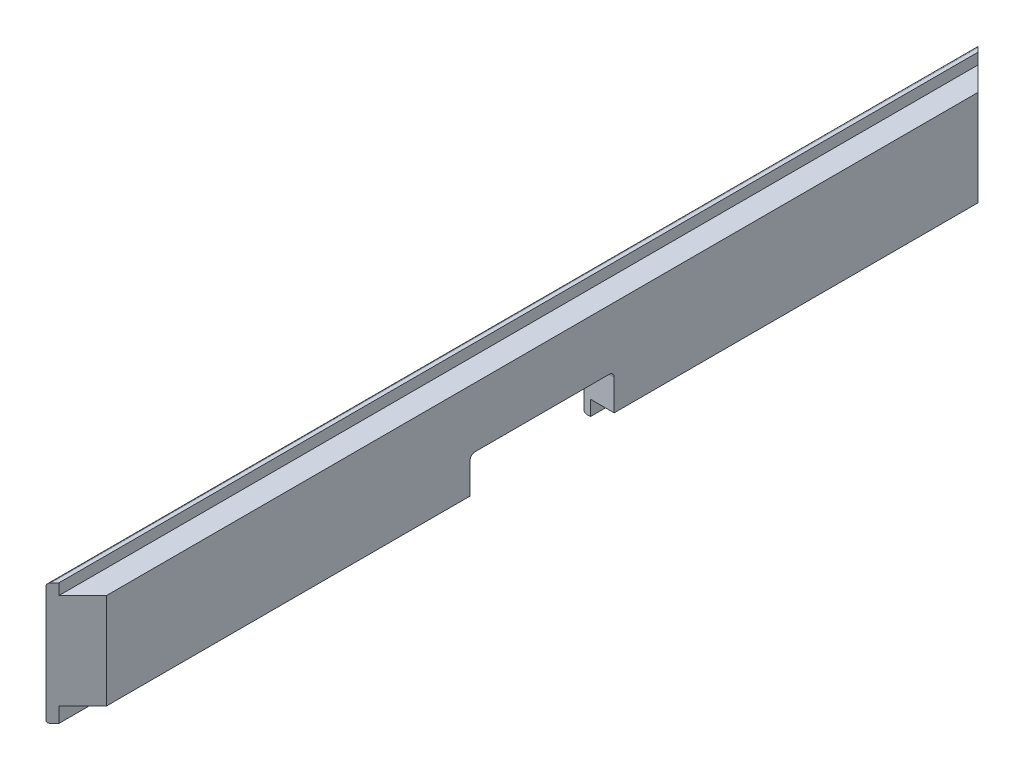
ISO-10303-21;
HEADER;
FILE_DESCRIPTION(('STEP AP214'),'2;1');
FILE_NAME('part.step','',(''),(''),'','','');
FILE_SCHEMA(('AUTOMOTIVE_DESIGN { 1 0 10303 214 1 1 1 1 }'));
ENDSEC;
DATA;
#1=APPLICATION_CONTEXT('core data for automotive mechanical design processes');
#2=APPLICATION_PROTOCOL_DEFINITION('international standard','automotive_design',2000,#1);
#3=PRODUCT_CONTEXT('',#1,'mechanical');
#4=PRODUCT('Part','Part','',(#3));
#5=PRODUCT_RELATED_PRODUCT_CATEGORY('part','',(#4));
#6=PRODUCT_DEFINITION_FORMATION('','',#4);
#7=PRODUCT_DEFINITION_CONTEXT('part definition',#1,'design');
#8=PRODUCT_DEFINITION('design','',#6,#7);
#9=PRODUCT_DEFINITION_SHAPE('','',#8);
#10=(LENGTH_UNIT() NAMED_UNIT(*) SI_UNIT(.MILLI.,.METRE.));
#11=(NAMED_UNIT(*) PLANE_ANGLE_UNIT() SI_UNIT($,.RADIAN.));
#12=(NAMED_UNIT(*) SI_UNIT($,.STERADIAN.) SOLID_ANGLE_UNIT());
#13=UNCERTAINTY_MEASURE_WITH_UNIT(LENGTH_MEASURE(1.E-05),#10,'distance_accuracy_value','');
#14=(GEOMETRIC_REPRESENTATION_CONTEXT(3) GLOBAL_UNCERTAINTY_ASSIGNED_CONTEXT((#13)) GLOBAL_UNIT_ASSIGNED_CONTEXT((#10,
#11,#12)) REPRESENTATION_CONTEXT('',''));
#15=CARTESIAN_POINT('',(0.,0.,0.));
#16=DIRECTION('',(0.,0.,1.));
#17=DIRECTION('',(1.,0.,0.));
#18=AXIS2_PLACEMENT_3D('',#15,#16,#17);
#19=CARTESIAN_POINT('',(0.,0.,294.55));
#20=DIRECTION('',(0.,1.,0.));
#21=DIRECTION('',(-1.,0.,0.));
#22=AXIS2_PLACEMENT_3D('',#19,#20,#21);
#23=PLANE('',#22);
#24=DIRECTION('',(-1.,0.,0.));
#25=VECTOR('',#24,1.);
#26=CARTESIAN_POINT('',(19.05,0.,45.525));
#27=LINE('',#26,#25);
#28=CARTESIAN_POINT('',(4.05,0.,45.525));
#29=VERTEX_POINT('',#28);
#30=CARTESIAN_POINT('',(1.5875,0.,45.525));
#31=VERTEX_POINT('',#30);
#32=EDGE_CURVE('E189',#29,#31,#27,.T.);
#33=ORIENTED_EDGE('',*,*,#32,.F.);
#34=DIRECTION('',(0.,0.,-1.));
#35=VECTOR('',#34,1.);
#36=CARTESIAN_POINT('',(4.05,0.,294.55));
#37=LINE('',#36,#35);
#38=CARTESIAN_POINT('',(4.05,0.,290.5));
#39=VERTEX_POINT('',#38);
#40=EDGE_CURVE('E206',#39,#29,#37,.T.);
#41=ORIENTED_EDGE('',*,*,#40,.F.);
#42=DIRECTION('',(0.707106781186547,0.,-0.707106781186548));
#43=VECTOR('',#42,1.);
#44=CARTESIAN_POINT('',(147.275,0.,147.275));
#45=LINE('',#44,#43);
#46=CARTESIAN_POINT('',(1.5875,0.,292.9625));
#47=VERTEX_POINT('',#46);
#48=EDGE_CURVE('E301',#47,#39,#45,.T.);
#49=ORIENTED_EDGE('',*,*,#48,.F.);
#50=DIRECTION('',(0.,0.,-1.));
#51=VECTOR('',#50,1.);
#52=CARTESIAN_POINT('',(1.5875,0.,-294.55));
#53=LINE('',#52,#51);
#54=EDGE_CURVE('E215',#47,#31,#53,.T.);
#55=ORIENTED_EDGE('',*,*,#54,.T.);
#56=EDGE_LOOP('',(#33,#41,#49,#55));
#57=FACE_BOUND('',#56,.T.);
#58=ADVANCED_FACE('F43',(#57),#23,.F.);
#59=CARTESIAN_POINT('',(4.05,0.,294.55));
#60=DIRECTION('',(-1.,0.,0.));
#61=DIRECTION('',(0.,0.,1.));
#62=AXIS2_PLACEMENT_3D('',#59,#60,#61);
#63=PLANE('',#62);
#64=DIRECTION('',(0.,-1.,0.));
#65=VECTOR('',#64,1.);
#66=CARTESIAN_POINT('',(4.05,0.,45.525));
#67=LINE('',#66,#65);
#68=CARTESIAN_POINT('',(4.05,9.525,45.525));
#69=VERTEX_POINT('',#68);
#70=EDGE_CURVE('E287',#69,#29,#67,.T.);
#71=ORIENTED_EDGE('',*,*,#70,.F.);
#72=DIRECTION('',(0.,0.,-1.));
#73=VECTOR('',#72,1.);
#74=CARTESIAN_POINT('',(4.05,9.525,294.55));
#75=LINE('',#74,#73);
#76=CARTESIAN_POINT('',(4.05,9.525,290.5));
#77=VERTEX_POINT('',#76);
#78=EDGE_CURVE('E207',#77,#69,#75,.T.);
#79=ORIENTED_EDGE('',*,*,#78,.F.);
#80=DIRECTION('',(0.,1.,0.));
#81=VECTOR('',#80,1.);
#82=CARTESIAN_POINT('',(4.05,0.,290.5));
#83=LINE('',#82,#81);
#84=EDGE_CURVE('E337',#39,#77,#83,.T.);
#85=ORIENTED_EDGE('',*,*,#84,.F.);
#86=ORIENTED_EDGE('',*,*,#40,.T.);
#87=EDGE_LOOP('',(#71,#79,#85,#86));
#88=FACE_BOUND('',#87,.T.);
#89=ADVANCED_FACE('F385',(#88),#63,.F.);
#90=CARTESIAN_POINT('',(0.,9.525,294.55));
#91=DIRECTION('',(0.,-1.,0.));
#92=DIRECTION('',(1.,0.,0.));
#93=AXIS2_PLACEMENT_3D('',#90,#91,#92);
#94=PLANE('',#93);
#95=CARTESIAN_POINT('',(11.55,9.525,104.55));
#96=DIRECTION('',(0.,-1.,0.));
#97=DIRECTION('',(0.,0.,-1.));
#98=AXIS2_PLACEMENT_3D('',#95,#96,#97);
#99=CIRCLE('',#98,3.95);
#100=CARTESIAN_POINT('',(11.55,9.525,100.6));
#101=VERTEX_POINT('',#100);
#102=EDGE_CURVE('E289',#101,#101,#99,.T.);
#103=ORIENTED_EDGE('',*,*,#102,.F.);
#104=EDGE_LOOP('',(#103));
#105=FACE_BOUND('',#104,.T.);
#106=ORIENTED_EDGE('',*,*,#78,.T.);
#107=DIRECTION('',(1.,0.,0.));
#108=VECTOR('',#107,1.);
#109=CARTESIAN_POINT('',(0.,9.525,45.525));
#110=LINE('',#109,#108);
#111=CARTESIAN_POINT('',(19.05,9.525,45.525));
#112=VERTEX_POINT('',#111);
#113=EDGE_CURVE('E285',#69,#112,#110,.T.);
#114=ORIENTED_EDGE('',*,*,#113,.T.);
#115=DIRECTION('',(0.,0.,-1.));
#116=VECTOR('',#115,1.);
#117=CARTESIAN_POINT('',(19.05,9.525,294.55));
#118=LINE('',#117,#116);
#119=CARTESIAN_POINT('',(19.05,9.525,275.5));
#120=VERTEX_POINT('',#119);
#121=EDGE_CURVE('E275',#120,#112,#118,.T.);
#122=ORIENTED_EDGE('',*,*,#121,.F.);
#123=DIRECTION('',(-0.707106781186547,0.,0.707106781186548));
#124=VECTOR('',#123,1.);
#125=CARTESIAN_POINT('',(0.,9.525,294.55));
#126=LINE('',#125,#124);
#127=EDGE_CURVE('E334',#120,#77,#126,.T.);
#128=ORIENTED_EDGE('',*,*,#127,.T.);
#129=EDGE_LOOP('',(#106,#114,#122,#128));
#130=FACE_BOUND('',#129,.T.);
#131=ADVANCED_FACE('F364',(#105,#130),#94,.T.);
#132=CARTESIAN_POINT('',(19.05,0.,294.55));
#133=DIRECTION('',(-1.,0.,0.));
#134=DIRECTION('',(0.,0.,1.));
#135=AXIS2_PLACEMENT_3D('',#132,#133,#134);
#136=PLANE('',#135);
#137=DIRECTION('',(0.,-1.,0.));
#138=VECTOR('',#137,1.);
#139=CARTESIAN_POINT('',(19.05,0.,45.525));
#140=LINE('',#139,#138);
#141=CARTESIAN_POINT('',(19.05,29.04,45.525));
#142=VERTEX_POINT('',#141);
#143=EDGE_CURVE('E272',#142,#112,#140,.T.);
#144=ORIENTED_EDGE('',*,*,#143,.F.);
#145=CARTESIAN_POINT('',(19.05,29.04,42.35));
#146=DIRECTION('',(-1.,0.,0.));
#147=DIRECTION('',(0.,0.,1.));
#148=AXIS2_PLACEMENT_3D('',#145,#146,#147);
#149=CIRCLE('',#148,3.175);
#150=CARTESIAN_POINT('',(19.05,32.215,42.35));
#151=VERTEX_POINT('',#150);
#152=EDGE_CURVE('E11',#142,#151,#149,.T.);
#153=ORIENTED_EDGE('',*,*,#152,.T.);
#154=DIRECTION('',(0.,0.,1.));
#155=VECTOR('',#154,1.);
#156=CARTESIAN_POINT('',(19.05,32.215,0.));
#157=LINE('',#156,#155);
#158=CARTESIAN_POINT('',(19.05,32.215,-42.35));
#159=VERTEX_POINT('',#158);
#160=EDGE_CURVE('E256',#159,#151,#157,.T.);
#161=ORIENTED_EDGE('',*,*,#160,.F.);
#162=CARTESIAN_POINT('',(19.05,29.04,-42.35));
#163=DIRECTION('',(-1.,0.,0.));
#164=DIRECTION('',(0.,0.,1.));
#165=AXIS2_PLACEMENT_3D('',#162,#163,#164);
#166=CIRCLE('',#165,3.175);
#167=CARTESIAN_POINT('',(19.05,29.04,-45.525));
#168=VERTEX_POINT('',#167);
#169=EDGE_CURVE('E250',#159,#168,#166,.T.);
#170=ORIENTED_EDGE('',*,*,#169,.T.);
#171=DIRECTION('',(0.,-1.,0.));
#172=VECTOR('',#171,1.);
#173=CARTESIAN_POINT('',(19.05,0.,-45.525));
#174=LINE('',#173,#172);
#175=CARTESIAN_POINT('',(19.05,9.525,-45.525));
#176=VERTEX_POINT('',#175);
#177=EDGE_CURVE('E190',#168,#176,#174,.T.);
#178=ORIENTED_EDGE('',*,*,#177,.T.);
#179=CARTESIAN_POINT('',(19.05,9.525,-275.5));
#180=VERTEX_POINT('',#179);
#181=EDGE_CURVE('E352',#176,#180,#118,.T.);
#182=ORIENTED_EDGE('',*,*,#181,.T.);
#183=DIRECTION('',(0.,1.,0.));
#184=VECTOR('',#183,1.);
#185=CARTESIAN_POINT('',(19.05,0.,-275.5));
#186=LINE('',#185,#184);
#187=CARTESIAN_POINT('',(19.05,70.,-275.5));
#188=VERTEX_POINT('',#187);
#189=EDGE_CURVE('E304',#180,#188,#186,.T.);
#190=ORIENTED_EDGE('',*,*,#189,.T.);
#191=DIRECTION('',(0.,0.,-1.));
#192=VECTOR('',#191,1.);
#193=CARTESIAN_POINT('',(19.05,70.,294.55));
#194=LINE('',#193,#192);
#195=CARTESIAN_POINT('',(19.05,70.,275.5));
#196=VERTEX_POINT('',#195);
#197=EDGE_CURVE('E350',#196,#188,#194,.T.);
#198=ORIENTED_EDGE('',*,*,#197,.F.);
#199=DIRECTION('',(0.,1.,0.));
#200=VECTOR('',#199,1.);
#201=CARTESIAN_POINT('',(19.05,0.,275.5));
#202=LINE('',#201,#200);
#203=EDGE_CURVE('E303',#120,#196,#202,.T.);
#204=ORIENTED_EDGE('',*,*,#203,.F.);
#205=ORIENTED_EDGE('',*,*,#121,.T.);
#206=EDGE_LOOP('',(#144,#153,#161,#170,#178,#182,#190,#198,#204,#205));
#207=FACE_BOUND('',#206,.T.);
#208=ADVANCED_FACE('F254',(#207),#136,.F.);
#209=CARTESIAN_POINT('',(1.5875,1.5875,294.55));
#210=DIRECTION('',(0.,0.,1.));
#211=DIRECTION('',(1.,0.,0.));
#212=AXIS2_PLACEMENT_3D('',#209,#210,#211);
#213=CYLINDRICAL_SURFACE('',#212,1.5875);
#214=DIRECTION('',(0.,0.,-1.));
#215=VECTOR('',#214,1.);
#216=CARTESIAN_POINT('',(0.,1.5875,294.55));
#217=LINE('',#216,#215);
#218=CARTESIAN_POINT('',(0.,1.5875,45.525));
#219=VERTEX_POINT('',#218);
#220=CARTESIAN_POINT('',(0.,1.5875,294.55));
#221=VERTEX_POINT('',#220);
#222=EDGE_CURVE('E221',#219,#221,#217,.F.);
#223=ORIENTED_EDGE('',*,*,#222,.F.);
#224=CARTESIAN_POINT('',(1.5875,1.5875,45.525));
#225=DIRECTION('',(0.,0.,-1.));
#226=DIRECTION('',(-1.,0.,0.));
#227=AXIS2_PLACEMENT_3D('',#224,#225,#226);
#228=CIRCLE('',#227,1.5875);
#229=EDGE_CURVE('E199',#219,#31,#228,.F.);
#230=ORIENTED_EDGE('',*,*,#229,.T.);
#231=ORIENTED_EDGE('',*,*,#54,.F.);
#232=CARTESIAN_POINT('',(1.5875,1.5875,292.9625));
#233=DIRECTION('',(0.707106781186548,0.,0.707106781186547));
#234=DIRECTION('',(-0.707106781186547,0.,0.707106781186548));
#235=AXIS2_PLACEMENT_3D('',#232,#233,#234);
#236=ELLIPSE('',#235,2.24506403026729,1.5875);
#237=EDGE_CURVE('E331',#47,#221,#236,.F.);
#238=ORIENTED_EDGE('',*,*,#237,.T.);
#239=EDGE_LOOP('',(#223,#230,#231,#238));
#240=FACE_BOUND('',#239,.T.);
#241=ADVANCED_FACE('F402',(#240),#213,.T.);
#242=CARTESIAN_POINT('',(0.,0.,294.55));
#243=DIRECTION('',(-1.,0.,0.));
#244=DIRECTION('',(0.,0.,1.));
#245=AXIS2_PLACEMENT_3D('',#242,#243,#244);
#246=PLANE('',#245);
#247=DIRECTION('',(0.,-1.,0.));
#248=VECTOR('',#247,1.);
#249=CARTESIAN_POINT('',(0.,0.,-45.525));
#250=LINE('',#249,#248);
#251=CARTESIAN_POINT('',(0.,29.04,-45.525));
#252=VERTEX_POINT('',#251);
#253=CARTESIAN_POINT('',(0.,1.5875,-45.525));
#254=VERTEX_POINT('',#253);
#255=EDGE_CURVE('E235',#252,#254,#250,.T.);
#256=ORIENTED_EDGE('',*,*,#255,.F.);
#257=CARTESIAN_POINT('',(0.,29.04,-42.35));
#258=DIRECTION('',(-1.,0.,0.));
#259=DIRECTION('',(0.,0.,1.));
#260=AXIS2_PLACEMENT_3D('',#257,#258,#259);
#261=CIRCLE('',#260,3.175);
#262=CARTESIAN_POINT('',(0.,32.215,-42.35));
#263=VERTEX_POINT('',#262);
#264=EDGE_CURVE('E248',#252,#263,#261,.F.);
#265=ORIENTED_EDGE('',*,*,#264,.T.);
#266=DIRECTION('',(0.,0.,1.));
#267=VECTOR('',#266,1.);
#268=CARTESIAN_POINT('',(0.,32.215,294.55));
#269=LINE('',#268,#267);
#270=CARTESIAN_POINT('',(0.,32.215,42.35));
#271=VERTEX_POINT('',#270);
#272=EDGE_CURVE('E233',#263,#271,#269,.T.);
#273=ORIENTED_EDGE('',*,*,#272,.T.);
#274=CARTESIAN_POINT('',(0.,29.04,42.35));
#275=DIRECTION('',(-1.,0.,0.));
#276=DIRECTION('',(0.,0.,1.));
#277=AXIS2_PLACEMENT_3D('',#274,#275,#276);
#278=CIRCLE('',#277,3.175);
#279=CARTESIAN_POINT('',(0.,29.04,45.525));
#280=VERTEX_POINT('',#279);
#281=EDGE_CURVE('E51',#271,#280,#278,.F.);
#282=ORIENTED_EDGE('',*,*,#281,.T.);
#283=DIRECTION('',(0.,-1.,0.));
#284=VECTOR('',#283,1.);
#285=CARTESIAN_POINT('',(0.,0.,45.525));
#286=LINE('',#285,#284);
#287=EDGE_CURVE('E237',#280,#219,#286,.T.);
#288=ORIENTED_EDGE('',*,*,#287,.T.);
#289=ORIENTED_EDGE('',*,*,#222,.T.);
#290=DIRECTION('',(0.,1.,0.));
#291=VECTOR('',#290,1.);
#292=CARTESIAN_POINT('',(0.,0.,294.55));
#293=LINE('',#292,#291);
#294=CARTESIAN_POINT('',(0.,75.4125,294.55));
#295=VERTEX_POINT('',#294);
#296=EDGE_CURVE('E340',#221,#295,#293,.T.);
#297=ORIENTED_EDGE('',*,*,#296,.T.);
#298=DIRECTION('',(0.,0.,-1.));
#299=VECTOR('',#298,1.);
#300=CARTESIAN_POINT('',(0.,75.4125,294.55));
#301=LINE('',#300,#299);
#302=CARTESIAN_POINT('',(0.,75.4125,-294.55));
#303=VERTEX_POINT('',#302);
#304=EDGE_CURVE('E218',#295,#303,#301,.T.);
#305=ORIENTED_EDGE('',*,*,#304,.T.);
#306=DIRECTION('',(0.,1.,0.));
#307=VECTOR('',#306,1.);
#308=CARTESIAN_POINT('',(0.,0.,-294.55));
#309=LINE('',#308,#307);
#310=CARTESIAN_POINT('',(0.,1.5875,-294.55));
#311=VERTEX_POINT('',#310);
#312=EDGE_CURVE('E339',#311,#303,#309,.T.);
#313=ORIENTED_EDGE('',*,*,#312,.F.);
#314=EDGE_CURVE('E222',#311,#254,#217,.F.);
#315=ORIENTED_EDGE('',*,*,#314,.T.);
#316=EDGE_LOOP('',(#256,#265,#273,#282,#288,#289,#297,#305,#313,#315));
#317=FACE_BOUND('',#316,.T.);
#318=ADVANCED_FACE('F265',(#317),#246,.T.);
#319=CARTESIAN_POINT('',(4.05,0.,-45.525));
#320=VERTEX_POINT('',#319);
#321=CARTESIAN_POINT('',(4.05,0.,-290.5));
#322=VERTEX_POINT('',#321);
#323=EDGE_CURVE('E196',#320,#322,#37,.T.);
#324=ORIENTED_EDGE('',*,*,#323,.F.);
#325=DIRECTION('',(-1.,0.,0.));
#326=VECTOR('',#325,1.);
#327=CARTESIAN_POINT('',(19.05,0.,-45.525));
#328=LINE('',#327,#326);
#329=CARTESIAN_POINT('',(1.5875,0.,-45.525));
#330=VERTEX_POINT('',#329);
#331=EDGE_CURVE('E177',#320,#330,#328,.T.);
#332=ORIENTED_EDGE('',*,*,#331,.T.);
#333=CARTESIAN_POINT('',(1.58750000000001,0.,-292.9625));
#334=VERTEX_POINT('',#333);
#335=EDGE_CURVE('E210',#330,#334,#53,.T.);
#336=ORIENTED_EDGE('',*,*,#335,.T.);
#337=DIRECTION('',(0.707106781186547,0.,0.707106781186548));
#338=VECTOR('',#337,1.);
#339=CARTESIAN_POINT('',(147.275,0.,-147.275));
#340=LINE('',#339,#338);
#341=EDGE_CURVE('E205',#334,#322,#340,.T.);
#342=ORIENTED_EDGE('',*,*,#341,.T.);
#343=EDGE_LOOP('',(#324,#332,#336,#342));
#344=FACE_BOUND('',#343,.T.);
#345=ADVANCED_FACE('F203',(#344),#23,.F.);
#346=CARTESIAN_POINT('',(4.05,9.525,-45.525));
#347=VERTEX_POINT('',#346);
#348=CARTESIAN_POINT('',(4.05000000000005,9.525,-290.5));
#349=VERTEX_POINT('',#348);
#350=EDGE_CURVE('E198',#347,#349,#75,.T.);
#351=ORIENTED_EDGE('',*,*,#350,.F.);
#352=DIRECTION('',(0.,-1.,0.));
#353=VECTOR('',#352,1.);
#354=CARTESIAN_POINT('',(4.05,0.,-45.525));
#355=LINE('',#354,#353);
#356=EDGE_CURVE('E182',#347,#320,#355,.T.);
#357=ORIENTED_EDGE('',*,*,#356,.T.);
#358=ORIENTED_EDGE('',*,*,#323,.T.);
#359=DIRECTION('',(0.,1.,0.));
#360=VECTOR('',#359,1.);
#361=CARTESIAN_POINT('',(4.05,0.,-290.5));
#362=LINE('',#361,#360);
#363=EDGE_CURVE('E321',#322,#349,#362,.T.);
#364=ORIENTED_EDGE('',*,*,#363,.T.);
#365=EDGE_LOOP('',(#351,#357,#358,#364));
#366=FACE_BOUND('',#365,.T.);
#367=ADVANCED_FACE('F194',(#366),#63,.F.);
#368=DIRECTION('',(1.,0.,0.));
#369=VECTOR('',#368,1.);
#370=CARTESIAN_POINT('',(0.,9.525,-45.525));
#371=LINE('',#370,#369);
#372=EDGE_CURVE('E200',#347,#176,#371,.T.);
#373=ORIENTED_EDGE('',*,*,#372,.F.);
#374=ORIENTED_EDGE('',*,*,#350,.T.);
#375=DIRECTION('',(-0.707106781186547,0.,-0.707106781186548));
#376=VECTOR('',#375,1.);
#377=CARTESIAN_POINT('',(294.55,9.52500000000003,1.66533453693773E-13));
#378=LINE('',#377,#376);
#379=EDGE_CURVE('E318',#180,#349,#378,.T.);
#380=ORIENTED_EDGE('',*,*,#379,.F.);
#381=ORIENTED_EDGE('',*,*,#181,.F.);
#382=EDGE_LOOP('',(#373,#374,#380,#381));
#383=FACE_BOUND('',#382,.T.);
#384=CARTESIAN_POINT('',(11.55,9.525,-104.55));
#385=DIRECTION('',(0.,-1.,0.));
#386=DIRECTION('',(0.,0.,-1.));
#387=AXIS2_PLACEMENT_3D('',#384,#385,#386);
#388=CIRCLE('',#387,3.95);
#389=CARTESIAN_POINT('',(11.55,9.525,-108.5));
#390=VERTEX_POINT('',#389);
#391=EDGE_CURVE('E295',#390,#390,#388,.T.);
#392=ORIENTED_EDGE('',*,*,#391,.F.);
#393=EDGE_LOOP('',(#392));
#394=FACE_BOUND('',#393,.T.);
#395=ADVANCED_FACE('F359',(#383,#394),#94,.T.);
#396=CARTESIAN_POINT('',(0.,70.,294.55));
#397=DIRECTION('',(0.,-1.,0.));
#398=DIRECTION('',(0.,0.,-1.));
#399=AXIS2_PLACEMENT_3D('',#396,#397,#398);
#400=PLANE('',#399);
#401=DIRECTION('',(-0.707106781186547,0.,0.707106781186548));
#402=VECTOR('',#401,1.);
#403=CARTESIAN_POINT('',(0.,70.,294.55));
#404=LINE('',#403,#402);
#405=CARTESIAN_POINT('',(4.05,70.,290.5));
#406=VERTEX_POINT('',#405);
#407=EDGE_CURVE('E329',#196,#406,#404,.T.);
#408=ORIENTED_EDGE('',*,*,#407,.F.);
#409=ORIENTED_EDGE('',*,*,#197,.T.);
#410=DIRECTION('',(-0.707106781186547,0.,-0.707106781186548));
#411=VECTOR('',#410,1.);
#412=CARTESIAN_POINT('',(294.55,70.,1.66533453693773E-13));
#413=LINE('',#412,#411);
#414=CARTESIAN_POINT('',(4.05,70.,-290.5));
#415=VERTEX_POINT('',#414);
#416=EDGE_CURVE('E313',#188,#415,#413,.T.);
#417=ORIENTED_EDGE('',*,*,#416,.T.);
#418=DIRECTION('',(0.,0.,-1.));
#419=VECTOR('',#418,1.);
#420=CARTESIAN_POINT('',(4.05,70.,294.55));
#421=LINE('',#420,#419);
#422=EDGE_CURVE('E347',#406,#415,#421,.T.);
#423=ORIENTED_EDGE('',*,*,#422,.F.);
#424=EDGE_LOOP('',(#408,#409,#417,#423));
#425=FACE_BOUND('',#424,.T.);
#426=ADVANCED_FACE('F362',(#425),#400,.F.);
#427=CARTESIAN_POINT('',(4.04999999999996,0.,294.55));
#428=DIRECTION('',(1.,0.,0.));
#429=DIRECTION('',(0.,1.,0.));
#430=AXIS2_PLACEMENT_3D('',#427,#428,#429);
#431=PLANE('',#430);
#432=DIRECTION('',(0.,0.,-1.));
#433=VECTOR('',#432,1.);
#434=CARTESIAN_POINT('',(4.05,77.,294.55));
#435=LINE('',#434,#433);
#436=CARTESIAN_POINT('',(4.05,77.,290.5));
#437=VERTEX_POINT('',#436);
#438=CARTESIAN_POINT('',(4.05,77.,-290.5));
#439=VERTEX_POINT('',#438);
#440=EDGE_CURVE('E343',#437,#439,#435,.T.);
#441=ORIENTED_EDGE('',*,*,#440,.F.);
#442=DIRECTION('',(0.,-1.,0.));
#443=VECTOR('',#442,1.);
#444=CARTESIAN_POINT('',(4.04999999999996,0.,290.5));
#445=LINE('',#444,#443);
#446=EDGE_CURVE('E326',#437,#406,#445,.T.);
#447=ORIENTED_EDGE('',*,*,#446,.T.);
#448=ORIENTED_EDGE('',*,*,#422,.T.);
#449=DIRECTION('',(0.,-1.,0.));
#450=VECTOR('',#449,1.);
#451=CARTESIAN_POINT('',(4.04999999999996,2.8796409701215E-13,-290.5));
#452=LINE('',#451,#450);
#453=EDGE_CURVE('E311',#439,#415,#452,.T.);
#454=ORIENTED_EDGE('',*,*,#453,.F.);
#455=EDGE_LOOP('',(#441,#447,#448,#454));
#456=FACE_BOUND('',#455,.T.);
#457=ADVANCED_FACE('F416',(#456),#431,.T.);
#458=CARTESIAN_POINT('',(0.,77.,294.55));
#459=DIRECTION('',(0.,1.,0.));
#460=DIRECTION('',(0.,0.,1.));
#461=AXIS2_PLACEMENT_3D('',#458,#459,#460);
#462=PLANE('',#461);
#463=DIRECTION('',(0.,0.,-1.));
#464=VECTOR('',#463,1.);
#465=CARTESIAN_POINT('',(1.5875,77.,294.55));
#466=LINE('',#465,#464);
#467=CARTESIAN_POINT('',(1.5875,77.,-292.9625));
#468=VERTEX_POINT('',#467);
#469=CARTESIAN_POINT('',(1.5875,77.,292.9625));
#470=VERTEX_POINT('',#469);
#471=EDGE_CURVE('E225',#468,#470,#466,.F.);
#472=ORIENTED_EDGE('',*,*,#471,.T.);
#473=DIRECTION('',(0.707106781186547,0.,-0.707106781186548));
#474=VECTOR('',#473,1.);
#475=CARTESIAN_POINT('',(0.,77.,294.55));
#476=LINE('',#475,#474);
#477=EDGE_CURVE('E323',#470,#437,#476,.T.);
#478=ORIENTED_EDGE('',*,*,#477,.T.);
#479=ORIENTED_EDGE('',*,*,#440,.T.);
#480=DIRECTION('',(0.707106781186547,0.,0.707106781186548));
#481=VECTOR('',#480,1.);
#482=CARTESIAN_POINT('',(294.55,77.,1.66533453693773E-13));
#483=LINE('',#482,#481);
#484=EDGE_CURVE('E306',#468,#439,#483,.T.);
#485=ORIENTED_EDGE('',*,*,#484,.F.);
#486=EDGE_LOOP('',(#472,#478,#479,#485));
#487=FACE_BOUND('',#486,.T.);
#488=ADVANCED_FACE('F413',(#487),#462,.T.);
#489=CARTESIAN_POINT('',(1.5875,1.5875,-45.525));
#490=DIRECTION('',(0.,0.,-1.));
#491=DIRECTION('',(-1.,0.,0.));
#492=AXIS2_PLACEMENT_3D('',#489,#490,#491);
#493=CIRCLE('',#492,1.5875);
#494=EDGE_CURVE('E185',#254,#330,#493,.F.);
#495=ORIENTED_EDGE('',*,*,#494,.F.);
#496=ORIENTED_EDGE('',*,*,#314,.F.);
#497=CARTESIAN_POINT('',(1.5875,1.5875,-292.9625));
#498=DIRECTION('',(-0.707106781186548,0.,0.707106781186547));
#499=DIRECTION('',(0.707106781186547,0.,0.707106781186548));
#500=AXIS2_PLACEMENT_3D('',#497,#498,#499);
#501=ELLIPSE('',#500,2.24506403026729,1.5875);
#502=EDGE_CURVE('E316',#334,#311,#501,.F.);
#503=ORIENTED_EDGE('',*,*,#502,.F.);
#504=ORIENTED_EDGE('',*,*,#335,.F.);
#505=EDGE_LOOP('',(#495,#496,#503,#504));
#506=FACE_BOUND('',#505,.T.);
#507=ADVANCED_FACE('F409',(#506),#213,.T.);
#508=CARTESIAN_POINT('',(1.5875,75.4125,294.55));
#509=DIRECTION('',(0.,0.,-1.));
#510=DIRECTION('',(-1.,0.,0.));
#511=AXIS2_PLACEMENT_3D('',#508,#509,#510);
#512=CYLINDRICAL_SURFACE('',#511,1.5875);
#513=ORIENTED_EDGE('',*,*,#304,.F.);
#514=CARTESIAN_POINT('',(1.5875,75.4125,292.9625));
#515=DIRECTION('',(0.707106781186548,0.,0.707106781186547));
#516=DIRECTION('',(0.707106781186547,0.,-0.707106781186548));
#517=AXIS2_PLACEMENT_3D('',#514,#515,#516);
#518=ELLIPSE('',#517,2.24506403026729,1.5875);
#519=EDGE_CURVE('E230',#295,#470,#518,.F.);
#520=ORIENTED_EDGE('',*,*,#519,.T.);
#521=ORIENTED_EDGE('',*,*,#471,.F.);
#522=CARTESIAN_POINT('',(1.5875,75.4125,-292.9625));
#523=DIRECTION('',(-0.707106781186548,0.,0.707106781186547));
#524=DIRECTION('',(-0.707106781186547,0.,-0.707106781186548));
#525=AXIS2_PLACEMENT_3D('',#522,#523,#524);
#526=ELLIPSE('',#525,2.24506403026729,1.5875);
#527=EDGE_CURVE('E228',#303,#468,#526,.F.);
#528=ORIENTED_EDGE('',*,*,#527,.F.);
#529=EDGE_LOOP('',(#513,#520,#521,#528));
#530=FACE_BOUND('',#529,.T.);
#531=ADVANCED_FACE('F447',(#530),#512,.T.);
#532=CARTESIAN_POINT('',(147.275,0.,-147.275));
#533=DIRECTION('',(-0.707106781186548,0.,0.707106781186547));
#534=DIRECTION('',(0.707106781186547,0.,0.707106781186548));
#535=AXIS2_PLACEMENT_3D('',#532,#533,#534);
#536=PLANE('',#535);
#537=ORIENTED_EDGE('',*,*,#341,.F.);
#538=ORIENTED_EDGE('',*,*,#502,.T.);
#539=ORIENTED_EDGE('',*,*,#312,.T.);
#540=ORIENTED_EDGE('',*,*,#527,.T.);
#541=ORIENTED_EDGE('',*,*,#484,.T.);
#542=ORIENTED_EDGE('',*,*,#453,.T.);
#543=ORIENTED_EDGE('',*,*,#416,.F.);
#544=ORIENTED_EDGE('',*,*,#189,.F.);
#545=ORIENTED_EDGE('',*,*,#379,.T.);
#546=ORIENTED_EDGE('',*,*,#363,.F.);
#547=EDGE_LOOP('',(#537,#538,#539,#540,#541,#542,#543,#544,#545,#546));
#548=FACE_BOUND('',#547,.T.);
#549=ADVANCED_FACE('F358',(#548),#536,.F.);
#550=CARTESIAN_POINT('',(147.275,0.,147.275));
#551=DIRECTION('',(0.707106781186548,0.,0.707106781186547));
#552=DIRECTION('',(0.707106781186547,0.,-0.707106781186548));
#553=AXIS2_PLACEMENT_3D('',#550,#551,#552);
#554=PLANE('',#553);
#555=ORIENTED_EDGE('',*,*,#84,.T.);
#556=ORIENTED_EDGE('',*,*,#127,.F.);
#557=ORIENTED_EDGE('',*,*,#203,.T.);
#558=ORIENTED_EDGE('',*,*,#407,.T.);
#559=ORIENTED_EDGE('',*,*,#446,.F.);
#560=ORIENTED_EDGE('',*,*,#477,.F.);
#561=ORIENTED_EDGE('',*,*,#519,.F.);
#562=ORIENTED_EDGE('',*,*,#296,.F.);
#563=ORIENTED_EDGE('',*,*,#237,.F.);
#564=ORIENTED_EDGE('',*,*,#48,.T.);
#565=EDGE_LOOP('',(#555,#556,#557,#558,#559,#560,#561,#562,#563,#564));
#566=FACE_BOUND('',#565,.T.);
#567=ADVANCED_FACE('F380',(#566),#554,.T.);
#568=CARTESIAN_POINT('',(11.55,24.525,-104.55));
#569=DIRECTION('',(0.,-1.,0.));
#570=DIRECTION('',(0.,0.,-1.));
#571=AXIS2_PLACEMENT_3D('',#568,#569,#570);
#572=CONICAL_SURFACE('',#571,3.95,1.02974425867665);
#573=CARTESIAN_POINT('',(11.55,26.8983994451589,-104.55));
#574=VERTEX_POINT('',#573);
#575=VERTEX_LOOP('',#574);
#576=FACE_BOUND('',#575,.T.);
#577=CARTESIAN_POINT('',(11.55,24.525,-104.55));
#578=DIRECTION('',(0.,-1.,0.));
#579=DIRECTION('',(0.,0.,-1.));
#580=AXIS2_PLACEMENT_3D('',#577,#578,#579);
#581=CIRCLE('',#580,3.95);
#582=CARTESIAN_POINT('',(11.55,24.525,-108.5));
#583=VERTEX_POINT('',#582);
#584=EDGE_CURVE('E298',#583,#583,#581,.T.);
#585=ORIENTED_EDGE('',*,*,#584,.T.);
#586=EDGE_LOOP('',(#585));
#587=FACE_BOUND('',#586,.T.);
#588=ADVANCED_FACE('F370',(#576,#587),#572,.F.);
#589=CARTESIAN_POINT('',(11.55,9.525,-104.55));
#590=DIRECTION('',(0.,-1.,0.));
#591=DIRECTION('',(0.,0.,-1.));
#592=AXIS2_PLACEMENT_3D('',#589,#590,#591);
#593=CYLINDRICAL_SURFACE('',#592,3.95);
#594=ORIENTED_EDGE('',*,*,#584,.F.);
#595=EDGE_LOOP('',(#594));
#596=FACE_BOUND('',#595,.T.);
#597=ORIENTED_EDGE('',*,*,#391,.T.);
#598=EDGE_LOOP('',(#597));
#599=FACE_BOUND('',#598,.T.);
#600=ADVANCED_FACE('F367',(#596,#599),#593,.F.);
#601=CARTESIAN_POINT('',(11.55,24.525,104.55));
#602=DIRECTION('',(0.,-1.,0.));
#603=DIRECTION('',(0.,0.,-1.));
#604=AXIS2_PLACEMENT_3D('',#601,#602,#603);
#605=CONICAL_SURFACE('',#604,3.95,1.02974425867665);
#606=CARTESIAN_POINT('',(11.55,26.8983994451589,104.55));
#607=VERTEX_POINT('',#606);
#608=VERTEX_LOOP('',#607);
#609=FACE_BOUND('',#608,.T.);
#610=CARTESIAN_POINT('',(11.55,24.525,104.55));
#611=DIRECTION('',(0.,-1.,0.));
#612=DIRECTION('',(0.,0.,-1.));
#613=AXIS2_PLACEMENT_3D('',#610,#611,#612);
#614=CIRCLE('',#613,3.95);
#615=CARTESIAN_POINT('',(11.55,24.525,100.6));
#616=VERTEX_POINT('',#615);
#617=EDGE_CURVE('E292',#616,#616,#614,.T.);
#618=ORIENTED_EDGE('',*,*,#617,.T.);
#619=EDGE_LOOP('',(#618));
#620=FACE_BOUND('',#619,.T.);
#621=ADVANCED_FACE('F369',(#609,#620),#605,.F.);
#622=CARTESIAN_POINT('',(11.55,9.525,104.55));
#623=DIRECTION('',(0.,-1.,0.));
#624=DIRECTION('',(0.,0.,-1.));
#625=AXIS2_PLACEMENT_3D('',#622,#623,#624);
#626=CYLINDRICAL_SURFACE('',#625,3.95);
#627=ORIENTED_EDGE('',*,*,#617,.F.);
#628=EDGE_LOOP('',(#627));
#629=FACE_BOUND('',#628,.T.);
#630=ORIENTED_EDGE('',*,*,#102,.T.);
#631=EDGE_LOOP('',(#630));
#632=FACE_BOUND('',#631,.T.);
#633=ADVANCED_FACE('F377',(#629,#632),#626,.F.);
#634=CARTESIAN_POINT('',(19.05,0.,45.525));
#635=DIRECTION('',(0.,0.,-1.));
#636=DIRECTION('',(-1.,0.,0.));
#637=AXIS2_PLACEMENT_3D('',#634,#635,#636);
#638=PLANE('',#637);
#639=ORIENTED_EDGE('',*,*,#287,.F.);
#640=DIRECTION('',(-1.,0.,0.));
#641=VECTOR('',#640,1.);
#642=CARTESIAN_POINT('',(19.05,29.04,45.525));
#643=LINE('',#642,#641);
#644=EDGE_CURVE('E58',#280,#142,#643,.F.);
#645=ORIENTED_EDGE('',*,*,#644,.T.);
#646=ORIENTED_EDGE('',*,*,#143,.T.);
#647=ORIENTED_EDGE('',*,*,#113,.F.);
#648=ORIENTED_EDGE('',*,*,#70,.T.);
#649=ORIENTED_EDGE('',*,*,#32,.T.);
#650=ORIENTED_EDGE('',*,*,#229,.F.);
#651=EDGE_LOOP('',(#639,#645,#646,#647,#648,#649,#650));
#652=FACE_BOUND('',#651,.T.);
#653=ADVANCED_FACE('F437',(#652),#638,.T.);
#654=CARTESIAN_POINT('',(19.05,0.,-45.525));
#655=DIRECTION('',(0.,0.,-1.));
#656=DIRECTION('',(-1.,0.,0.));
#657=AXIS2_PLACEMENT_3D('',#654,#655,#656);
#658=PLANE('',#657);
#659=ORIENTED_EDGE('',*,*,#177,.F.);
#660=DIRECTION('',(-1.,0.,0.));
#661=VECTOR('',#660,1.);
#662=CARTESIAN_POINT('',(19.05,29.04,-45.525));
#663=LINE('',#662,#661);
#664=EDGE_CURVE('E239',#168,#252,#663,.T.);
#665=ORIENTED_EDGE('',*,*,#664,.T.);
#666=ORIENTED_EDGE('',*,*,#255,.T.);
#667=ORIENTED_EDGE('',*,*,#494,.T.);
#668=ORIENTED_EDGE('',*,*,#331,.F.);
#669=ORIENTED_EDGE('',*,*,#356,.F.);
#670=ORIENTED_EDGE('',*,*,#372,.T.);
#671=EDGE_LOOP('',(#659,#665,#666,#667,#668,#669,#670));
#672=FACE_BOUND('',#671,.T.);
#673=ADVANCED_FACE('F180',(#672),#658,.F.);
#674=CARTESIAN_POINT('',(19.05,32.215,0.));
#675=DIRECTION('',(0.,-1.,0.));
#676=DIRECTION('',(0.,0.,-1.));
#677=AXIS2_PLACEMENT_3D('',#674,#675,#676);
#678=PLANE('',#677);
#679=ORIENTED_EDGE('',*,*,#272,.F.);
#680=DIRECTION('',(-1.,0.,0.));
#681=VECTOR('',#680,1.);
#682=CARTESIAN_POINT('',(19.05,32.215,-42.35));
#683=LINE('',#682,#681);
#684=EDGE_CURVE('E245',#263,#159,#683,.F.);
#685=ORIENTED_EDGE('',*,*,#684,.T.);
#686=ORIENTED_EDGE('',*,*,#160,.T.);
#687=DIRECTION('',(-1.,0.,0.));
#688=VECTOR('',#687,1.);
#689=CARTESIAN_POINT('',(0.,32.215,42.35));
#690=LINE('',#689,#688);
#691=EDGE_CURVE('E242',#151,#271,#690,.T.);
#692=ORIENTED_EDGE('',*,*,#691,.T.);
#693=EDGE_LOOP('',(#679,#685,#686,#692));
#694=FACE_BOUND('',#693,.T.);
#695=ADVANCED_FACE('F267',(#694),#678,.T.);
#696=CARTESIAN_POINT('',(19.05,29.04,-42.35));
#697=DIRECTION('',(-1.,0.,0.));
#698=DIRECTION('',(0.,0.,1.));
#699=AXIS2_PLACEMENT_3D('',#696,#697,#698);
#700=CYLINDRICAL_SURFACE('',#699,3.175);
#701=ORIENTED_EDGE('',*,*,#169,.F.);
#702=ORIENTED_EDGE('',*,*,#684,.F.);
#703=ORIENTED_EDGE('',*,*,#264,.F.);
#704=ORIENTED_EDGE('',*,*,#664,.F.);
#705=EDGE_LOOP('',(#701,#702,#703,#704));
#706=FACE_BOUND('',#705,.T.);
#707=ADVANCED_FACE('F263',(#706),#700,.F.);
#708=CARTESIAN_POINT('',(19.05,29.04,42.35));
#709=DIRECTION('',(1.,0.,0.));
#710=DIRECTION('',(0.,0.,-1.));
#711=AXIS2_PLACEMENT_3D('',#708,#709,#710);
#712=CYLINDRICAL_SURFACE('',#711,3.175);
#713=ORIENTED_EDGE('',*,*,#152,.F.);
#714=ORIENTED_EDGE('',*,*,#644,.F.);
#715=ORIENTED_EDGE('',*,*,#281,.F.);
#716=ORIENTED_EDGE('',*,*,#691,.F.);
#717=EDGE_LOOP('',(#713,#714,#715,#716));
#718=FACE_BOUND('',#717,.T.);
#719=ADVANCED_FACE('F45',(#718),#712,.F.);
#720=CLOSED_SHELL('',(#58,#89,#131,#208,#241,#318,#345,#367,#395,#426,#457,#488,#507,#531,#549,
#567,#588,#600,#621,#633,#653,#673,#695,#707,#719));
#721=MANIFOLD_SOLID_BREP('B2',#720);
#722=ADVANCED_BREP_SHAPE_REPRESENTATION('',(#18,#721),#14);
#723=SHAPE_DEFINITION_REPRESENTATION(#9,#722);
ENDSEC;
END-ISO-10303-21;
